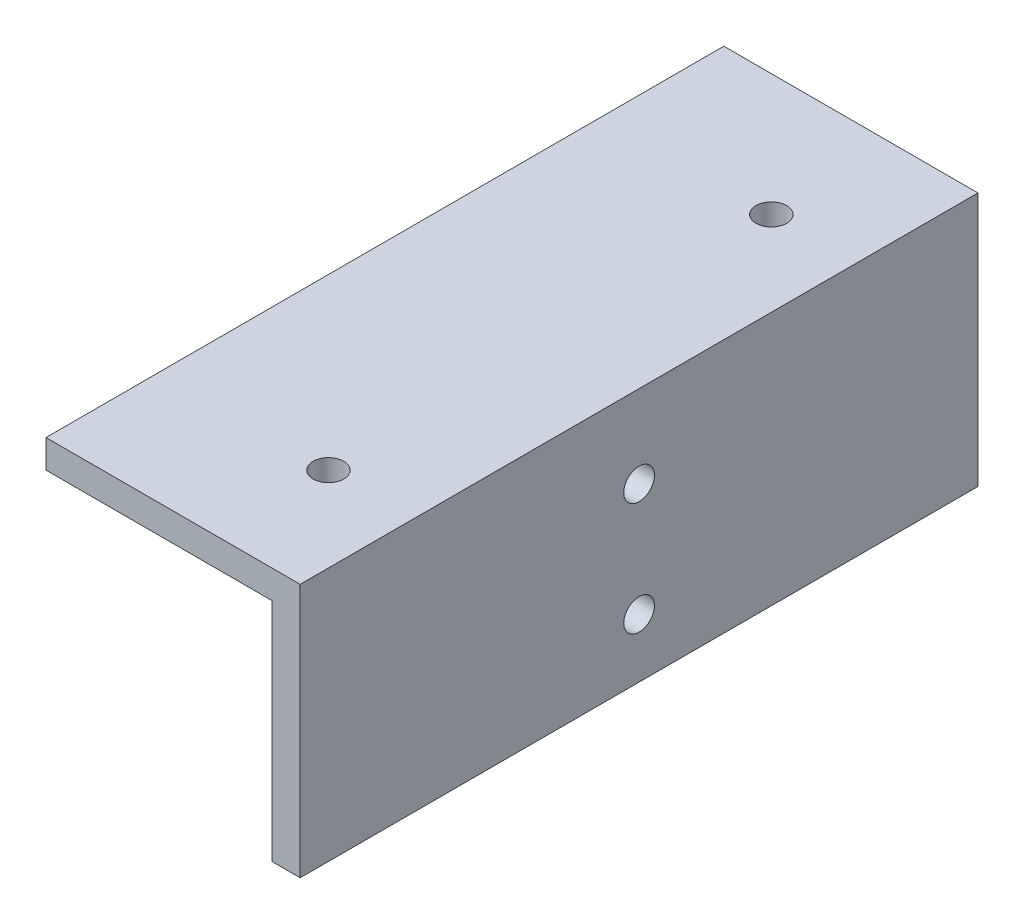
ISO-10303-21;
HEADER;
FILE_DESCRIPTION(('STEP AP214'),'2;1');
FILE_NAME('part.step','',(''),(''),'','','');
FILE_SCHEMA(('AUTOMOTIVE_DESIGN { 1 0 10303 214 1 1 1 1 }'));
ENDSEC;
DATA;
#1=APPLICATION_CONTEXT('core data for automotive mechanical design processes');
#2=APPLICATION_PROTOCOL_DEFINITION('international standard','automotive_design',2000,#1);
#3=PRODUCT_CONTEXT('',#1,'mechanical');
#4=PRODUCT('Part','Part','',(#3));
#5=PRODUCT_RELATED_PRODUCT_CATEGORY('part','',(#4));
#6=PRODUCT_DEFINITION_FORMATION('','',#4);
#7=PRODUCT_DEFINITION_CONTEXT('part definition',#1,'design');
#8=PRODUCT_DEFINITION('design','',#6,#7);
#9=PRODUCT_DEFINITION_SHAPE('','',#8);
#10=(LENGTH_UNIT() NAMED_UNIT(*) SI_UNIT(.MILLI.,.METRE.));
#11=(NAMED_UNIT(*) PLANE_ANGLE_UNIT() SI_UNIT($,.RADIAN.));
#12=(NAMED_UNIT(*) SI_UNIT($,.STERADIAN.) SOLID_ANGLE_UNIT());
#13=UNCERTAINTY_MEASURE_WITH_UNIT(LENGTH_MEASURE(1.E-05),#10,'distance_accuracy_value','');
#14=(GEOMETRIC_REPRESENTATION_CONTEXT(3) GLOBAL_UNCERTAINTY_ASSIGNED_CONTEXT((#13)) GLOBAL_UNIT_ASSIGNED_CONTEXT((#10,
#11,#12)) REPRESENTATION_CONTEXT('',''));
#15=CARTESIAN_POINT('',(0.,0.,0.));
#16=DIRECTION('',(0.,0.,1.));
#17=DIRECTION('',(1.,0.,0.));
#18=AXIS2_PLACEMENT_3D('',#15,#16,#17);
#19=CARTESIAN_POINT('',(-3.175,0.,76.2));
#20=DIRECTION('',(0.,1.,0.));
#21=DIRECTION('',(0.,0.,1.));
#22=AXIS2_PLACEMENT_3D('',#19,#20,#21);
#23=PLANE('',#22);
#24=DIRECTION('',(1.,0.,0.));
#25=VECTOR('',#24,1.);
#26=CARTESIAN_POINT('',(-3.175,0.,0.));
#27=LINE('',#26,#25);
#28=CARTESIAN_POINT('',(-3.175,0.,0.));
#29=VERTEX_POINT('',#28);
#30=CARTESIAN_POINT('',(0.,0.,0.));
#31=VERTEX_POINT('',#30);
#32=EDGE_CURVE('E117',#29,#31,#27,.T.);
#33=ORIENTED_EDGE('',*,*,#32,.T.);
#34=DIRECTION('',(0.,0.,-1.));
#35=VECTOR('',#34,1.);
#36=CARTESIAN_POINT('',(0.,0.,76.2));
#37=LINE('',#36,#35);
#38=CARTESIAN_POINT('',(0.,0.,76.2));
#39=VERTEX_POINT('',#38);
#40=EDGE_CURVE('E11',#39,#31,#37,.T.);
#41=ORIENTED_EDGE('',*,*,#40,.F.);
#42=DIRECTION('',(1.,0.,0.));
#43=VECTOR('',#42,1.);
#44=CARTESIAN_POINT('',(-3.175,0.,76.2));
#45=LINE('',#44,#43);
#46=CARTESIAN_POINT('',(-3.175,0.,76.2));
#47=VERTEX_POINT('',#46);
#48=EDGE_CURVE('E128',#47,#39,#45,.T.);
#49=ORIENTED_EDGE('',*,*,#48,.F.);
#50=DIRECTION('',(0.,0.,-1.));
#51=VECTOR('',#50,1.);
#52=CARTESIAN_POINT('',(-3.175,0.,76.2));
#53=LINE('',#52,#51);
#54=EDGE_CURVE('E113',#47,#29,#53,.T.);
#55=ORIENTED_EDGE('',*,*,#54,.T.);
#56=EDGE_LOOP('',(#33,#41,#49,#55));
#57=FACE_BOUND('',#56,.T.);
#58=ADVANCED_FACE('F33',(#57),#23,.F.);
#59=CARTESIAN_POINT('',(0.,0.,76.2));
#60=DIRECTION('',(-1.,0.,0.));
#61=DIRECTION('',(0.,0.,1.));
#62=AXIS2_PLACEMENT_3D('',#59,#60,#61);
#63=PLANE('',#62);
#64=CARTESIAN_POINT('',(0.,6.59999999999997,38.1));
#65=DIRECTION('',(-1.,0.,0.));
#66=DIRECTION('',(0.,0.,1.));
#67=AXIS2_PLACEMENT_3D('',#64,#65,#66);
#68=CIRCLE('',#67,1.72719999999999);
#69=CARTESIAN_POINT('',(0.,6.59999999999997,39.8272));
#70=VERTEX_POINT('',#69);
#71=EDGE_CURVE('E261',#70,#70,#68,.T.);
#72=ORIENTED_EDGE('',*,*,#71,.T.);
#73=EDGE_LOOP('',(#72));
#74=FACE_BOUND('',#73,.T.);
#75=CARTESIAN_POINT('',(0.,19.3,38.1));
#76=DIRECTION('',(-1.,0.,0.));
#77=DIRECTION('',(0.,0.,1.));
#78=AXIS2_PLACEMENT_3D('',#75,#76,#77);
#79=CIRCLE('',#78,1.72719999999999);
#80=CARTESIAN_POINT('',(0.,19.3,39.8272));
#81=VERTEX_POINT('',#80);
#82=EDGE_CURVE('E121',#81,#81,#79,.T.);
#83=ORIENTED_EDGE('',*,*,#82,.T.);
#84=EDGE_LOOP('',(#83));
#85=FACE_BOUND('',#84,.T.);
#86=DIRECTION('',(0.,1.,0.));
#87=VECTOR('',#86,1.);
#88=CARTESIAN_POINT('',(0.,0.,0.));
#89=LINE('',#88,#87);
#90=CARTESIAN_POINT('',(0.,28.575,0.));
#91=VERTEX_POINT('',#90);
#92=EDGE_CURVE('E120',#31,#91,#89,.T.);
#93=ORIENTED_EDGE('',*,*,#92,.T.);
#94=DIRECTION('',(0.,0.,-1.));
#95=VECTOR('',#94,1.);
#96=CARTESIAN_POINT('',(0.,28.575,76.2));
#97=LINE('',#96,#95);
#98=CARTESIAN_POINT('',(0.,28.575,76.2));
#99=VERTEX_POINT('',#98);
#100=EDGE_CURVE('E41',#99,#91,#97,.T.);
#101=ORIENTED_EDGE('',*,*,#100,.F.);
#102=DIRECTION('',(0.,1.,0.));
#103=VECTOR('',#102,1.);
#104=CARTESIAN_POINT('',(0.,0.,76.2));
#105=LINE('',#104,#103);
#106=EDGE_CURVE('E86',#39,#99,#105,.T.);
#107=ORIENTED_EDGE('',*,*,#106,.F.);
#108=ORIENTED_EDGE('',*,*,#40,.T.);
#109=EDGE_LOOP('',(#93,#101,#107,#108));
#110=FACE_BOUND('',#109,.T.);
#111=ADVANCED_FACE('F156',(#74,#85,#110),#63,.F.);
#112=CARTESIAN_POINT('',(0.,28.575,76.2));
#113=DIRECTION('',(0.,-1.,0.));
#114=DIRECTION('',(1.,0.,0.));
#115=AXIS2_PLACEMENT_3D('',#112,#113,#114);
#116=PLANE('',#115);
#117=CARTESIAN_POINT('',(-9.52500000000001,28.575,63.5));
#118=DIRECTION('',(0.,-1.,0.));
#119=DIRECTION('',(1.,0.,0.));
#120=AXIS2_PLACEMENT_3D('',#117,#118,#119);
#121=CIRCLE('',#120,1.72719999999999);
#122=CARTESIAN_POINT('',(-7.79780000000001,28.575,63.5));
#123=VERTEX_POINT('',#122);
#124=EDGE_CURVE('E277',#123,#123,#121,.T.);
#125=ORIENTED_EDGE('',*,*,#124,.T.);
#126=EDGE_LOOP('',(#125));
#127=FACE_BOUND('',#126,.T.);
#128=CARTESIAN_POINT('',(-9.52500000000001,28.575,13.7115939046919));
#129=DIRECTION('',(0.,-1.,0.));
#130=DIRECTION('',(1.,0.,0.));
#131=AXIS2_PLACEMENT_3D('',#128,#129,#130);
#132=CIRCLE('',#131,1.72719999999999);
#133=CARTESIAN_POINT('',(-7.79780000000001,28.575,13.7115939046919));
#134=VERTEX_POINT('',#133);
#135=EDGE_CURVE('E271',#134,#134,#132,.T.);
#136=ORIENTED_EDGE('',*,*,#135,.T.);
#137=EDGE_LOOP('',(#136));
#138=FACE_BOUND('',#137,.T.);
#139=DIRECTION('',(-1.,0.,0.));
#140=VECTOR('',#139,1.);
#141=CARTESIAN_POINT('',(0.,28.575,0.));
#142=LINE('',#141,#140);
#143=CARTESIAN_POINT('',(-28.575,28.575,0.));
#144=VERTEX_POINT('',#143);
#145=EDGE_CURVE('E123',#91,#144,#142,.T.);
#146=ORIENTED_EDGE('',*,*,#145,.T.);
#147=DIRECTION('',(0.,0.,-1.));
#148=VECTOR('',#147,1.);
#149=CARTESIAN_POINT('',(-28.575,28.575,76.2));
#150=LINE('',#149,#148);
#151=CARTESIAN_POINT('',(-28.575,28.575,76.2));
#152=VERTEX_POINT('',#151);
#153=EDGE_CURVE('E108',#152,#144,#150,.T.);
#154=ORIENTED_EDGE('',*,*,#153,.F.);
#155=DIRECTION('',(-1.,0.,0.));
#156=VECTOR('',#155,1.);
#157=CARTESIAN_POINT('',(0.,28.575,76.2));
#158=LINE('',#157,#156);
#159=EDGE_CURVE('E99',#99,#152,#158,.T.);
#160=ORIENTED_EDGE('',*,*,#159,.F.);
#161=ORIENTED_EDGE('',*,*,#100,.T.);
#162=EDGE_LOOP('',(#146,#154,#160,#161));
#163=FACE_BOUND('',#162,.T.);
#164=ADVANCED_FACE('F134',(#127,#138,#163),#116,.F.);
#165=CARTESIAN_POINT('',(-28.575,28.575,76.2));
#166=DIRECTION('',(1.,0.,0.));
#167=DIRECTION('',(0.,0.,-1.));
#168=AXIS2_PLACEMENT_3D('',#165,#166,#167);
#169=PLANE('',#168);
#170=DIRECTION('',(0.,-1.,0.));
#171=VECTOR('',#170,1.);
#172=CARTESIAN_POINT('',(-28.575,28.575,0.));
#173=LINE('',#172,#171);
#174=CARTESIAN_POINT('',(-28.575,25.4,0.));
#175=VERTEX_POINT('',#174);
#176=EDGE_CURVE('E107',#144,#175,#173,.T.);
#177=ORIENTED_EDGE('',*,*,#176,.T.);
#178=DIRECTION('',(0.,0.,-1.));
#179=VECTOR('',#178,1.);
#180=CARTESIAN_POINT('',(-28.575,25.4,76.2));
#181=LINE('',#180,#179);
#182=CARTESIAN_POINT('',(-28.575,25.4,76.2));
#183=VERTEX_POINT('',#182);
#184=EDGE_CURVE('E104',#183,#175,#181,.T.);
#185=ORIENTED_EDGE('',*,*,#184,.F.);
#186=DIRECTION('',(0.,-1.,0.));
#187=VECTOR('',#186,1.);
#188=CARTESIAN_POINT('',(-28.575,28.575,76.2));
#189=LINE('',#188,#187);
#190=EDGE_CURVE('E93',#152,#183,#189,.T.);
#191=ORIENTED_EDGE('',*,*,#190,.F.);
#192=ORIENTED_EDGE('',*,*,#153,.T.);
#193=EDGE_LOOP('',(#177,#185,#191,#192));
#194=FACE_BOUND('',#193,.T.);
#195=ADVANCED_FACE('F105',(#194),#169,.F.);
#196=CARTESIAN_POINT('',(-28.575,25.4,76.2));
#197=DIRECTION('',(0.,1.,0.));
#198=DIRECTION('',(0.,0.,1.));
#199=AXIS2_PLACEMENT_3D('',#196,#197,#198);
#200=PLANE('',#199);
#201=CARTESIAN_POINT('',(-9.52500000000001,25.4,63.5));
#202=DIRECTION('',(0.,-1.,0.));
#203=DIRECTION('',(0.,0.,-1.));
#204=AXIS2_PLACEMENT_3D('',#201,#202,#203);
#205=CIRCLE('',#204,1.72719999999999);
#206=CARTESIAN_POINT('',(-9.52500000000001,25.4,61.7728));
#207=VERTEX_POINT('',#206);
#208=EDGE_CURVE('E280',#207,#207,#205,.T.);
#209=ORIENTED_EDGE('',*,*,#208,.F.);
#210=EDGE_LOOP('',(#209));
#211=FACE_BOUND('',#210,.T.);
#212=CARTESIAN_POINT('',(-9.52500000000001,25.4,13.7115939046919));
#213=DIRECTION('',(0.,-1.,0.));
#214=DIRECTION('',(0.,0.,-1.));
#215=AXIS2_PLACEMENT_3D('',#212,#213,#214);
#216=CIRCLE('',#215,1.72719999999999);
#217=CARTESIAN_POINT('',(-9.52500000000001,25.4,11.9843939046919));
#218=VERTEX_POINT('',#217);
#219=EDGE_CURVE('E274',#218,#218,#216,.T.);
#220=ORIENTED_EDGE('',*,*,#219,.F.);
#221=EDGE_LOOP('',(#220));
#222=FACE_BOUND('',#221,.T.);
#223=DIRECTION('',(1.,0.,0.));
#224=VECTOR('',#223,1.);
#225=CARTESIAN_POINT('',(-28.575,25.4,0.));
#226=LINE('',#225,#224);
#227=CARTESIAN_POINT('',(-3.175,25.4,0.));
#228=VERTEX_POINT('',#227);
#229=EDGE_CURVE('E72',#175,#228,#226,.T.);
#230=ORIENTED_EDGE('',*,*,#229,.T.);
#231=DIRECTION('',(0.,0.,-1.));
#232=VECTOR('',#231,1.);
#233=CARTESIAN_POINT('',(-3.175,25.4,76.2));
#234=LINE('',#233,#232);
#235=CARTESIAN_POINT('',(-3.175,25.4,76.2));
#236=VERTEX_POINT('',#235);
#237=EDGE_CURVE('E109',#236,#228,#234,.T.);
#238=ORIENTED_EDGE('',*,*,#237,.F.);
#239=DIRECTION('',(1.,0.,0.));
#240=VECTOR('',#239,1.);
#241=CARTESIAN_POINT('',(-28.575,25.4,76.2));
#242=LINE('',#241,#240);
#243=EDGE_CURVE('E97',#183,#236,#242,.T.);
#244=ORIENTED_EDGE('',*,*,#243,.F.);
#245=ORIENTED_EDGE('',*,*,#184,.T.);
#246=EDGE_LOOP('',(#230,#238,#244,#245));
#247=FACE_BOUND('',#246,.T.);
#248=ADVANCED_FACE('F111',(#211,#222,#247),#200,.F.);
#249=CARTESIAN_POINT('',(-3.175,25.4,76.2));
#250=DIRECTION('',(1.,0.,0.));
#251=DIRECTION('',(0.,1.,0.));
#252=AXIS2_PLACEMENT_3D('',#249,#250,#251);
#253=PLANE('',#252);
#254=CARTESIAN_POINT('',(-3.175,6.59999999999997,38.1));
#255=DIRECTION('',(-1.,0.,0.));
#256=DIRECTION('',(0.,0.,1.));
#257=AXIS2_PLACEMENT_3D('',#254,#255,#256);
#258=CIRCLE('',#257,1.72719999999999);
#259=CARTESIAN_POINT('',(-3.175,6.59999999999997,39.8272));
#260=VERTEX_POINT('',#259);
#261=EDGE_CURVE('E264',#260,#260,#258,.T.);
#262=ORIENTED_EDGE('',*,*,#261,.F.);
#263=EDGE_LOOP('',(#262));
#264=FACE_BOUND('',#263,.T.);
#265=CARTESIAN_POINT('',(-3.175,19.3,38.1));
#266=DIRECTION('',(-1.,0.,0.));
#267=DIRECTION('',(0.,0.,1.));
#268=AXIS2_PLACEMENT_3D('',#265,#266,#267);
#269=CIRCLE('',#268,1.72719999999999);
#270=CARTESIAN_POINT('',(-3.175,19.3,39.8272));
#271=VERTEX_POINT('',#270);
#272=EDGE_CURVE('E260',#271,#271,#269,.T.);
#273=ORIENTED_EDGE('',*,*,#272,.F.);
#274=EDGE_LOOP('',(#273));
#275=FACE_BOUND('',#274,.T.);
#276=DIRECTION('',(0.,-1.,0.));
#277=VECTOR('',#276,1.);
#278=CARTESIAN_POINT('',(-3.175,25.4,0.));
#279=LINE('',#278,#277);
#280=EDGE_CURVE('E78',#228,#29,#279,.T.);
#281=ORIENTED_EDGE('',*,*,#280,.T.);
#282=ORIENTED_EDGE('',*,*,#54,.F.);
#283=DIRECTION('',(0.,-1.,0.));
#284=VECTOR('',#283,1.);
#285=CARTESIAN_POINT('',(-3.175,25.4,76.2));
#286=LINE('',#285,#284);
#287=EDGE_CURVE('E49',#236,#47,#286,.T.);
#288=ORIENTED_EDGE('',*,*,#287,.F.);
#289=ORIENTED_EDGE('',*,*,#237,.T.);
#290=EDGE_LOOP('',(#281,#282,#288,#289));
#291=FACE_BOUND('',#290,.T.);
#292=ADVANCED_FACE('F141',(#264,#275,#291),#253,.F.);
#293=CARTESIAN_POINT('',(0.,0.,76.2));
#294=DIRECTION('',(0.,0.,1.));
#295=DIRECTION('',(1.,0.,0.));
#296=AXIS2_PLACEMENT_3D('',#293,#294,#295);
#297=PLANE('',#296);
#298=ORIENTED_EDGE('',*,*,#48,.T.);
#299=ORIENTED_EDGE('',*,*,#106,.T.);
#300=ORIENTED_EDGE('',*,*,#159,.T.);
#301=ORIENTED_EDGE('',*,*,#190,.T.);
#302=ORIENTED_EDGE('',*,*,#243,.T.);
#303=ORIENTED_EDGE('',*,*,#287,.T.);
#304=EDGE_LOOP('',(#298,#299,#300,#301,#302,#303));
#305=FACE_BOUND('',#304,.T.);
#306=ADVANCED_FACE('F95',(#305),#297,.T.);
#307=CARTESIAN_POINT('',(0.,0.,0.));
#308=DIRECTION('',(0.,0.,1.));
#309=DIRECTION('',(1.,0.,0.));
#310=AXIS2_PLACEMENT_3D('',#307,#308,#309);
#311=PLANE('',#310);
#312=ORIENTED_EDGE('',*,*,#32,.F.);
#313=ORIENTED_EDGE('',*,*,#280,.F.);
#314=ORIENTED_EDGE('',*,*,#229,.F.);
#315=ORIENTED_EDGE('',*,*,#176,.F.);
#316=ORIENTED_EDGE('',*,*,#145,.F.);
#317=ORIENTED_EDGE('',*,*,#92,.F.);
#318=EDGE_LOOP('',(#312,#313,#314,#315,#316,#317));
#319=FACE_BOUND('',#318,.T.);
#320=ADVANCED_FACE('F137',(#319),#311,.F.);
#321=CARTESIAN_POINT('',(-3.175,19.3,38.1));
#322=DIRECTION('',(-1.,0.,0.));
#323=DIRECTION('',(0.,0.,1.));
#324=AXIS2_PLACEMENT_3D('',#321,#322,#323);
#325=CYLINDRICAL_SURFACE('',#324,1.72719999999999);
#326=ORIENTED_EDGE('',*,*,#82,.F.);
#327=EDGE_LOOP('',(#326));
#328=FACE_BOUND('',#327,.T.);
#329=ORIENTED_EDGE('',*,*,#272,.T.);
#330=EDGE_LOOP('',(#329));
#331=FACE_BOUND('',#330,.T.);
#332=ADVANCED_FACE('F214',(#328,#331),#325,.F.);
#333=CARTESIAN_POINT('',(-3.175,6.59999999999997,38.1));
#334=DIRECTION('',(-1.,0.,0.));
#335=DIRECTION('',(0.,0.,1.));
#336=AXIS2_PLACEMENT_3D('',#333,#334,#335);
#337=CYLINDRICAL_SURFACE('',#336,1.72719999999999);
#338=ORIENTED_EDGE('',*,*,#71,.F.);
#339=EDGE_LOOP('',(#338));
#340=FACE_BOUND('',#339,.T.);
#341=ORIENTED_EDGE('',*,*,#261,.T.);
#342=EDGE_LOOP('',(#341));
#343=FACE_BOUND('',#342,.T.);
#344=ADVANCED_FACE('F194',(#340,#343),#337,.F.);
#345=CARTESIAN_POINT('',(-9.52500000000001,25.4,13.7115939046919));
#346=DIRECTION('',(0.,-1.,0.));
#347=DIRECTION('',(0.,0.,-1.));
#348=AXIS2_PLACEMENT_3D('',#345,#346,#347);
#349=CYLINDRICAL_SURFACE('',#348,1.72719999999999);
#350=ORIENTED_EDGE('',*,*,#135,.F.);
#351=EDGE_LOOP('',(#350));
#352=FACE_BOUND('',#351,.T.);
#353=ORIENTED_EDGE('',*,*,#219,.T.);
#354=EDGE_LOOP('',(#353));
#355=FACE_BOUND('',#354,.T.);
#356=ADVANCED_FACE('F188',(#352,#355),#349,.F.);
#357=CARTESIAN_POINT('',(-9.52500000000001,25.4,63.5));
#358=DIRECTION('',(0.,-1.,0.));
#359=DIRECTION('',(0.,0.,-1.));
#360=AXIS2_PLACEMENT_3D('',#357,#358,#359);
#361=CYLINDRICAL_SURFACE('',#360,1.72719999999999);
#362=ORIENTED_EDGE('',*,*,#124,.F.);
#363=EDGE_LOOP('',(#362));
#364=FACE_BOUND('',#363,.T.);
#365=ORIENTED_EDGE('',*,*,#208,.T.);
#366=EDGE_LOOP('',(#365));
#367=FACE_BOUND('',#366,.T.);
#368=ADVANCED_FACE('F193',(#364,#367),#361,.F.);
#369=CLOSED_SHELL('',(#58,#111,#164,#195,#248,#292,#306,#320,#332,#344,#356,#368));
#370=MANIFOLD_SOLID_BREP('B2',#369);
#371=ADVANCED_BREP_SHAPE_REPRESENTATION('',(#18,#370),#14);
#372=SHAPE_DEFINITION_REPRESENTATION(#9,#371);
ENDSEC;
END-ISO-10303-21;
